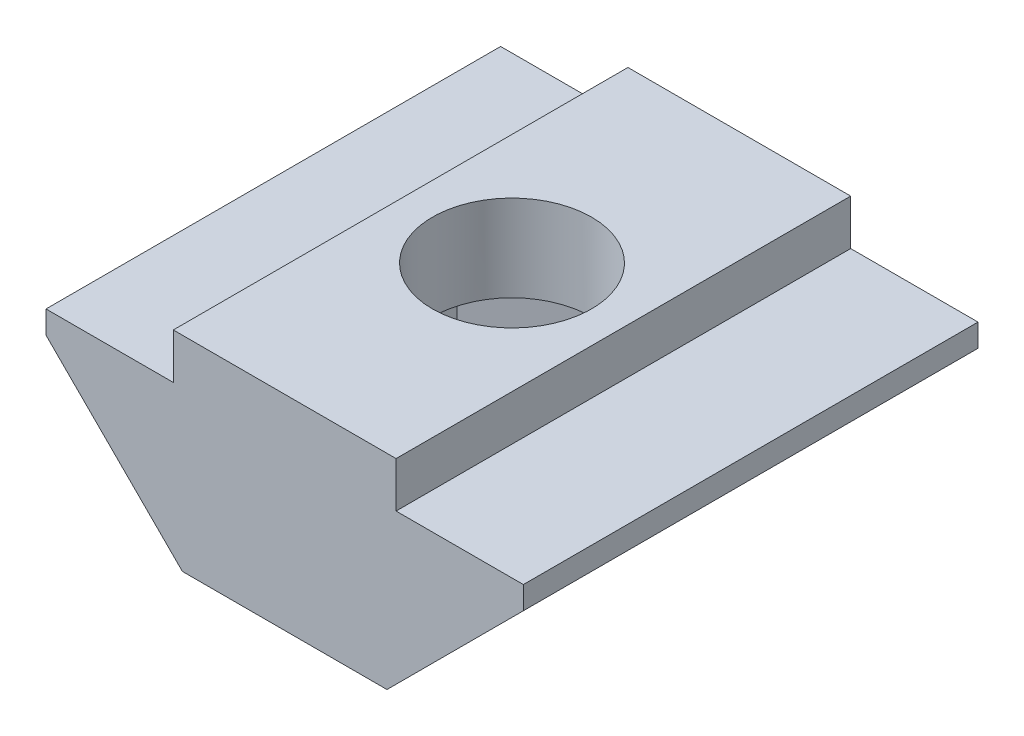
ISO-10303-21;
HEADER;
FILE_DESCRIPTION(('STEP AP214'),'2;1');
FILE_NAME('part.step','',(''),(''),'','','');
FILE_SCHEMA(('AUTOMOTIVE_DESIGN { 1 0 10303 214 1 1 1 1 }'));
ENDSEC;
DATA;
#1=APPLICATION_CONTEXT('core data for automotive mechanical design processes');
#2=APPLICATION_PROTOCOL_DEFINITION('international standard','automotive_design',2000,#1);
#3=PRODUCT_CONTEXT('',#1,'mechanical');
#4=PRODUCT('Part','Part','',(#3));
#5=PRODUCT_RELATED_PRODUCT_CATEGORY('part','',(#4));
#6=PRODUCT_DEFINITION_FORMATION('','',#4);
#7=PRODUCT_DEFINITION_CONTEXT('part definition',#1,'design');
#8=PRODUCT_DEFINITION('design','',#6,#7);
#9=PRODUCT_DEFINITION_SHAPE('','',#8);
#10=(LENGTH_UNIT() NAMED_UNIT(*) SI_UNIT(.MILLI.,.METRE.));
#11=(NAMED_UNIT(*) PLANE_ANGLE_UNIT() SI_UNIT($,.RADIAN.));
#12=(NAMED_UNIT(*) SI_UNIT($,.STERADIAN.) SOLID_ANGLE_UNIT());
#13=UNCERTAINTY_MEASURE_WITH_UNIT(LENGTH_MEASURE(1.E-05),#10,'distance_accuracy_value','');
#14=(GEOMETRIC_REPRESENTATION_CONTEXT(3) GLOBAL_UNCERTAINTY_ASSIGNED_CONTEXT((#13)) GLOBAL_UNIT_ASSIGNED_CONTEXT((#10,
#11,#12)) REPRESENTATION_CONTEXT('',''));
#15=CARTESIAN_POINT('',(0.,0.,0.));
#16=DIRECTION('',(0.,0.,1.));
#17=DIRECTION('',(1.,0.,0.));
#18=AXIS2_PLACEMENT_3D('',#15,#16,#17);
#19=CARTESIAN_POINT('',(-2.25,0.,100.));
#20=DIRECTION('',(0.,1.,0.));
#21=DIRECTION('',(-1.,0.,0.));
#22=AXIS2_PLACEMENT_3D('',#19,#20,#21);
#23=PLANE('',#22);
#24=DIRECTION('',(0.,0.,-1.));
#25=VECTOR('',#24,1.);
#26=CARTESIAN_POINT('',(2.25,0.,100.));
#27=LINE('',#26,#25);
#28=CARTESIAN_POINT('',(2.24999999999999,0.,48.0081415712958));
#29=VERTEX_POINT('',#28);
#30=CARTESIAN_POINT('',(2.25,0.,45.));
#31=VERTEX_POINT('',#30);
#32=EDGE_CURVE('E281',#29,#31,#27,.T.);
#33=ORIENTED_EDGE('',*,*,#32,.F.);
#34=DIRECTION('',(0.866025403784439,0.,0.5));
#35=VECTOR('',#34,1.);
#36=CARTESIAN_POINT('',(0.,0.,46.7091034656191));
#37=LINE('',#36,#35);
#38=CARTESIAN_POINT('',(0.,0.,46.7091034656191));
#39=VERTEX_POINT('',#38);
#40=EDGE_CURVE('E196',#39,#29,#37,.T.);
#41=ORIENTED_EDGE('',*,*,#40,.F.);
#42=DIRECTION('',(0.866025403784439,0.,-0.499999999999999));
#43=VECTOR('',#42,1.);
#44=CARTESIAN_POINT('',(-2.85,0.,48.3545517328096));
#45=LINE('',#44,#43);
#46=CARTESIAN_POINT('',(-2.25,0.,48.0081415712958));
#47=VERTEX_POINT('',#46);
#48=EDGE_CURVE('E184',#47,#39,#45,.T.);
#49=ORIENTED_EDGE('',*,*,#48,.F.);
#50=DIRECTION('',(0.,0.,-1.));
#51=VECTOR('',#50,1.);
#52=CARTESIAN_POINT('',(-2.25,0.,100.));
#53=LINE('',#52,#51);
#54=CARTESIAN_POINT('',(-2.25,0.,45.));
#55=VERTEX_POINT('',#54);
#56=EDGE_CURVE('E285',#47,#55,#53,.T.);
#57=ORIENTED_EDGE('',*,*,#56,.T.);
#58=DIRECTION('',(1.,0.,0.));
#59=VECTOR('',#58,1.);
#60=CARTESIAN_POINT('',(-5.25,0.,45.));
#61=LINE('',#60,#59);
#62=EDGE_CURVE('E248',#55,#31,#61,.T.);
#63=ORIENTED_EDGE('',*,*,#62,.T.);
#64=EDGE_LOOP('',(#33,#41,#49,#57,#63));
#65=FACE_BOUND('',#64,.T.);
#66=ADVANCED_FACE('F33',(#65),#23,.F.);
#67=CARTESIAN_POINT('',(0.,0.,50.));
#68=DIRECTION('',(0.,1.,0.));
#69=DIRECTION('',(0.,0.,1.));
#70=AXIS2_PLACEMENT_3D('',#67,#68,#69);
#71=CYLINDRICAL_SURFACE('',#70,1.75000000000001);
#72=CARTESIAN_POINT('',(0.,4.5,50.));
#73=DIRECTION('',(0.,1.,0.));
#74=DIRECTION('',(0.,0.,1.));
#75=AXIS2_PLACEMENT_3D('',#72,#73,#74);
#76=CIRCLE('',#75,1.75000000000001);
#77=CARTESIAN_POINT('',(0.,4.5,51.75));
#78=VERTEX_POINT('',#77);
#79=EDGE_CURVE('E278',#78,#78,#76,.T.);
#80=ORIENTED_EDGE('',*,*,#79,.T.);
#81=EDGE_LOOP('',(#80));
#82=FACE_BOUND('',#81,.T.);
#83=CARTESIAN_POINT('',(0.,2.6,50.));
#84=DIRECTION('',(0.,-1.,0.));
#85=DIRECTION('',(1.,0.,0.));
#86=AXIS2_PLACEMENT_3D('',#83,#84,#85);
#87=CIRCLE('',#86,1.75000000000001);
#88=CARTESIAN_POINT('',(1.75000000000001,2.6,50.));
#89=VERTEX_POINT('',#88);
#90=EDGE_CURVE('E203',#89,#89,#87,.F.);
#91=ORIENTED_EDGE('',*,*,#90,.F.);
#92=EDGE_LOOP('',(#91));
#93=FACE_BOUND('',#92,.T.);
#94=ADVANCED_FACE('F352',(#82,#93),#71,.F.);
#95=CARTESIAN_POINT('',(2.25,0.,100.));
#96=DIRECTION('',(-0.707106781186548,0.707106781186547,0.));
#97=DIRECTION('',(-0.707106781186547,-0.707106781186548,0.));
#98=AXIS2_PLACEMENT_3D('',#95,#96,#97);
#99=PLANE('',#98);
#100=DIRECTION('',(0.,0.,-1.));
#101=VECTOR('',#100,1.);
#102=CARTESIAN_POINT('',(2.85,0.600000000000003,100.));
#103=LINE('',#102,#101);
#104=CARTESIAN_POINT('',(2.85,0.600000000000003,51.6454482671904));
#105=VERTEX_POINT('',#104);
#106=CARTESIAN_POINT('',(2.85,0.600000000000003,48.3545517328096));
#107=VERTEX_POINT('',#106);
#108=EDGE_CURVE('E11',#105,#107,#103,.T.);
#109=ORIENTED_EDGE('',*,*,#108,.T.);
#110=DIRECTION('',(-0.654653670707977,-0.654653670707978,-0.377964473009227));
#111=VECTOR('',#110,1.);
#112=CARTESIAN_POINT('',(15.114648625492,12.864648625492,55.4355499182535));
#113=LINE('',#112,#111);
#114=EDGE_CURVE('E167',#107,#29,#113,.T.);
#115=ORIENTED_EDGE('',*,*,#114,.T.);
#116=ORIENTED_EDGE('',*,*,#32,.T.);
#117=DIRECTION('',(0.707106781186547,0.707106781186548,0.));
#118=VECTOR('',#117,1.);
#119=CARTESIAN_POINT('',(2.25,0.,45.));
#120=LINE('',#119,#118);
#121=CARTESIAN_POINT('',(5.25,3.,45.));
#122=VERTEX_POINT('',#121);
#123=EDGE_CURVE('E275',#31,#122,#120,.T.);
#124=ORIENTED_EDGE('',*,*,#123,.T.);
#125=DIRECTION('',(0.,0.,-1.));
#126=VECTOR('',#125,1.);
#127=CARTESIAN_POINT('',(5.25,3.,100.));
#128=LINE('',#127,#126);
#129=CARTESIAN_POINT('',(5.25,3.,55.));
#130=VERTEX_POINT('',#129);
#131=EDGE_CURVE('E303',#130,#122,#128,.T.);
#132=ORIENTED_EDGE('',*,*,#131,.F.);
#133=DIRECTION('',(-0.707106781186547,-0.707106781186548,0.));
#134=VECTOR('',#133,1.);
#135=CARTESIAN_POINT('',(2.25,0.,55.));
#136=LINE('',#135,#134);
#137=CARTESIAN_POINT('',(2.25,0.,55.));
#138=VERTEX_POINT('',#137);
#139=EDGE_CURVE('E245',#130,#138,#136,.T.);
#140=ORIENTED_EDGE('',*,*,#139,.T.);
#141=CARTESIAN_POINT('',(2.25,0.,51.9918584287042));
#142=VERTEX_POINT('',#141);
#143=EDGE_CURVE('E282',#138,#142,#27,.T.);
#144=ORIENTED_EDGE('',*,*,#143,.T.);
#145=DIRECTION('',(0.654653670707977,0.654653670707977,-0.377964473009228));
#146=VECTOR('',#145,1.);
#147=CARTESIAN_POINT('',(-9.62893433977771,-11.8789343397777,58.8501643674608));
#148=LINE('',#147,#146);
#149=EDGE_CURVE('E48',#142,#105,#148,.T.);
#150=ORIENTED_EDGE('',*,*,#149,.T.);
#151=EDGE_LOOP('',(#109,#115,#116,#124,#132,#140,#144,#150));
#152=FACE_BOUND('',#151,.T.);
#153=ADVANCED_FACE('F35',(#152),#99,.F.);
#154=CARTESIAN_POINT('',(5.25,3.,100.));
#155=DIRECTION('',(-1.,0.,0.));
#156=DIRECTION('',(0.,-1.,0.));
#157=AXIS2_PLACEMENT_3D('',#154,#155,#156);
#158=PLANE('',#157);
#159=DIRECTION('',(0.,0.,-1.));
#160=VECTOR('',#159,1.);
#161=CARTESIAN_POINT('',(5.25,3.5,100.));
#162=LINE('',#161,#160);
#163=CARTESIAN_POINT('',(5.25,3.5,55.));
#164=VERTEX_POINT('',#163);
#165=CARTESIAN_POINT('',(5.25,3.5,45.));
#166=VERTEX_POINT('',#165);
#167=EDGE_CURVE('E301',#164,#166,#162,.T.);
#168=ORIENTED_EDGE('',*,*,#167,.F.);
#169=DIRECTION('',(0.,1.,0.));
#170=VECTOR('',#169,1.);
#171=CARTESIAN_POINT('',(5.25,0.,55.));
#172=LINE('',#171,#170);
#173=EDGE_CURVE('E224',#130,#164,#172,.T.);
#174=ORIENTED_EDGE('',*,*,#173,.F.);
#175=ORIENTED_EDGE('',*,*,#131,.T.);
#176=DIRECTION('',(0.,1.,0.));
#177=VECTOR('',#176,1.);
#178=CARTESIAN_POINT('',(5.25,0.,45.));
#179=LINE('',#178,#177);
#180=EDGE_CURVE('E252',#122,#166,#179,.T.);
#181=ORIENTED_EDGE('',*,*,#180,.T.);
#182=EDGE_LOOP('',(#168,#174,#175,#181));
#183=FACE_BOUND('',#182,.T.);
#184=ADVANCED_FACE('F332',(#183),#158,.F.);
#185=CARTESIAN_POINT('',(5.25,3.5,100.));
#186=DIRECTION('',(0.,-1.,0.));
#187=DIRECTION('',(1.,0.,0.));
#188=AXIS2_PLACEMENT_3D('',#185,#186,#187);
#189=PLANE('',#188);
#190=DIRECTION('',(0.,0.,-1.));
#191=VECTOR('',#190,1.);
#192=CARTESIAN_POINT('',(2.45,3.5,100.));
#193=LINE('',#192,#191);
#194=CARTESIAN_POINT('',(2.45,3.5,55.));
#195=VERTEX_POINT('',#194);
#196=CARTESIAN_POINT('',(2.45,3.5,45.));
#197=VERTEX_POINT('',#196);
#198=EDGE_CURVE('E299',#195,#197,#193,.T.);
#199=ORIENTED_EDGE('',*,*,#198,.F.);
#200=DIRECTION('',(1.,0.,0.));
#201=VECTOR('',#200,1.);
#202=CARTESIAN_POINT('',(5.25,3.5,55.));
#203=LINE('',#202,#201);
#204=EDGE_CURVE('E242',#195,#164,#203,.T.);
#205=ORIENTED_EDGE('',*,*,#204,.T.);
#206=ORIENTED_EDGE('',*,*,#167,.T.);
#207=DIRECTION('',(-1.,0.,0.));
#208=VECTOR('',#207,1.);
#209=CARTESIAN_POINT('',(5.25,3.5,45.));
#210=LINE('',#209,#208);
#211=EDGE_CURVE('E272',#166,#197,#210,.T.);
#212=ORIENTED_EDGE('',*,*,#211,.T.);
#213=EDGE_LOOP('',(#199,#205,#206,#212));
#214=FACE_BOUND('',#213,.T.);
#215=ADVANCED_FACE('F389',(#214),#189,.F.);
#216=CARTESIAN_POINT('',(2.45,3.5,100.));
#217=DIRECTION('',(-1.,0.,0.));
#218=DIRECTION('',(0.,0.,1.));
#219=AXIS2_PLACEMENT_3D('',#216,#217,#218);
#220=PLANE('',#219);
#221=DIRECTION('',(0.,0.,-1.));
#222=VECTOR('',#221,1.);
#223=CARTESIAN_POINT('',(2.45,4.5,100.));
#224=LINE('',#223,#222);
#225=CARTESIAN_POINT('',(2.45,4.5,55.));
#226=VERTEX_POINT('',#225);
#227=CARTESIAN_POINT('',(2.45,4.5,45.));
#228=VERTEX_POINT('',#227);
#229=EDGE_CURVE('E297',#226,#228,#224,.T.);
#230=ORIENTED_EDGE('',*,*,#229,.F.);
#231=DIRECTION('',(0.,-1.,0.));
#232=VECTOR('',#231,1.);
#233=CARTESIAN_POINT('',(2.45,3.5,55.));
#234=LINE('',#233,#232);
#235=EDGE_CURVE('E239',#226,#195,#234,.T.);
#236=ORIENTED_EDGE('',*,*,#235,.T.);
#237=ORIENTED_EDGE('',*,*,#198,.T.);
#238=DIRECTION('',(0.,1.,0.));
#239=VECTOR('',#238,1.);
#240=CARTESIAN_POINT('',(2.45,3.5,45.));
#241=LINE('',#240,#239);
#242=EDGE_CURVE('E269',#197,#228,#241,.T.);
#243=ORIENTED_EDGE('',*,*,#242,.T.);
#244=EDGE_LOOP('',(#230,#236,#237,#243));
#245=FACE_BOUND('',#244,.T.);
#246=ADVANCED_FACE('F385',(#245),#220,.F.);
#247=CARTESIAN_POINT('',(2.45,4.5,100.));
#248=DIRECTION('',(0.,-1.,0.));
#249=DIRECTION('',(1.,0.,0.));
#250=AXIS2_PLACEMENT_3D('',#247,#248,#249);
#251=PLANE('',#250);
#252=ORIENTED_EDGE('',*,*,#79,.F.);
#253=EDGE_LOOP('',(#252));
#254=FACE_BOUND('',#253,.T.);
#255=DIRECTION('',(0.,0.,-1.));
#256=VECTOR('',#255,1.);
#257=CARTESIAN_POINT('',(-2.45,4.5,100.));
#258=LINE('',#257,#256);
#259=CARTESIAN_POINT('',(-2.45,4.5,55.));
#260=VERTEX_POINT('',#259);
#261=CARTESIAN_POINT('',(-2.45,4.5,45.));
#262=VERTEX_POINT('',#261);
#263=EDGE_CURVE('E295',#260,#262,#258,.T.);
#264=ORIENTED_EDGE('',*,*,#263,.F.);
#265=DIRECTION('',(1.,0.,0.));
#266=VECTOR('',#265,1.);
#267=CARTESIAN_POINT('',(2.45,4.5,55.));
#268=LINE('',#267,#266);
#269=EDGE_CURVE('E236',#260,#226,#268,.T.);
#270=ORIENTED_EDGE('',*,*,#269,.T.);
#271=ORIENTED_EDGE('',*,*,#229,.T.);
#272=DIRECTION('',(-1.,0.,0.));
#273=VECTOR('',#272,1.);
#274=CARTESIAN_POINT('',(2.45,4.5,45.));
#275=LINE('',#274,#273);
#276=EDGE_CURVE('E266',#228,#262,#275,.T.);
#277=ORIENTED_EDGE('',*,*,#276,.T.);
#278=EDGE_LOOP('',(#264,#270,#271,#277));
#279=FACE_BOUND('',#278,.T.);
#280=ADVANCED_FACE('F381',(#254,#279),#251,.F.);
#281=CARTESIAN_POINT('',(-2.45,3.5,100.));
#282=DIRECTION('',(1.,0.,0.));
#283=DIRECTION('',(0.,0.,-1.));
#284=AXIS2_PLACEMENT_3D('',#281,#282,#283);
#285=PLANE('',#284);
#286=DIRECTION('',(0.,0.,-1.));
#287=VECTOR('',#286,1.);
#288=CARTESIAN_POINT('',(-2.45,3.5,100.));
#289=LINE('',#288,#287);
#290=CARTESIAN_POINT('',(-2.45,3.5,55.));
#291=VERTEX_POINT('',#290);
#292=CARTESIAN_POINT('',(-2.45,3.5,45.));
#293=VERTEX_POINT('',#292);
#294=EDGE_CURVE('E293',#291,#293,#289,.T.);
#295=ORIENTED_EDGE('',*,*,#294,.F.);
#296=DIRECTION('',(0.,1.,0.));
#297=VECTOR('',#296,1.);
#298=CARTESIAN_POINT('',(-2.45,3.5,55.));
#299=LINE('',#298,#297);
#300=EDGE_CURVE('E233',#291,#260,#299,.T.);
#301=ORIENTED_EDGE('',*,*,#300,.T.);
#302=ORIENTED_EDGE('',*,*,#263,.T.);
#303=DIRECTION('',(0.,-1.,0.));
#304=VECTOR('',#303,1.);
#305=CARTESIAN_POINT('',(-2.45,3.5,45.));
#306=LINE('',#305,#304);
#307=EDGE_CURVE('E263',#262,#293,#306,.T.);
#308=ORIENTED_EDGE('',*,*,#307,.T.);
#309=EDGE_LOOP('',(#295,#301,#302,#308));
#310=FACE_BOUND('',#309,.T.);
#311=ADVANCED_FACE('F377',(#310),#285,.F.);
#312=CARTESIAN_POINT('',(-5.25,3.5,100.));
#313=DIRECTION('',(0.,-1.,0.));
#314=DIRECTION('',(0.,0.,-1.));
#315=AXIS2_PLACEMENT_3D('',#312,#313,#314);
#316=PLANE('',#315);
#317=DIRECTION('',(0.,0.,-1.));
#318=VECTOR('',#317,1.);
#319=CARTESIAN_POINT('',(-5.25,3.5,100.));
#320=LINE('',#319,#318);
#321=CARTESIAN_POINT('',(-5.25,3.5,55.));
#322=VERTEX_POINT('',#321);
#323=CARTESIAN_POINT('',(-5.25,3.5,45.));
#324=VERTEX_POINT('',#323);
#325=EDGE_CURVE('E291',#322,#324,#320,.T.);
#326=ORIENTED_EDGE('',*,*,#325,.F.);
#327=DIRECTION('',(1.,0.,0.));
#328=VECTOR('',#327,1.);
#329=CARTESIAN_POINT('',(-5.25,3.5,55.));
#330=LINE('',#329,#328);
#331=EDGE_CURVE('E230',#322,#291,#330,.T.);
#332=ORIENTED_EDGE('',*,*,#331,.T.);
#333=ORIENTED_EDGE('',*,*,#294,.T.);
#334=DIRECTION('',(-1.,0.,0.));
#335=VECTOR('',#334,1.);
#336=CARTESIAN_POINT('',(-5.25,3.5,45.));
#337=LINE('',#336,#335);
#338=EDGE_CURVE('E260',#293,#324,#337,.T.);
#339=ORIENTED_EDGE('',*,*,#338,.T.);
#340=EDGE_LOOP('',(#326,#332,#333,#339));
#341=FACE_BOUND('',#340,.T.);
#342=ADVANCED_FACE('F371',(#341),#316,.F.);
#343=CARTESIAN_POINT('',(-5.25,3.,100.));
#344=DIRECTION('',(1.,0.,0.));
#345=DIRECTION('',(0.,1.,0.));
#346=AXIS2_PLACEMENT_3D('',#343,#344,#345);
#347=PLANE('',#346);
#348=DIRECTION('',(0.,0.,-1.));
#349=VECTOR('',#348,1.);
#350=CARTESIAN_POINT('',(-5.25,3.,100.));
#351=LINE('',#350,#349);
#352=CARTESIAN_POINT('',(-5.25,3.,55.));
#353=VERTEX_POINT('',#352);
#354=CARTESIAN_POINT('',(-5.25,3.,45.));
#355=VERTEX_POINT('',#354);
#356=EDGE_CURVE('E289',#353,#355,#351,.T.);
#357=ORIENTED_EDGE('',*,*,#356,.F.);
#358=DIRECTION('',(0.,1.,0.));
#359=VECTOR('',#358,1.);
#360=CARTESIAN_POINT('',(-5.25,0.,55.));
#361=LINE('',#360,#359);
#362=EDGE_CURVE('E225',#353,#322,#361,.T.);
#363=ORIENTED_EDGE('',*,*,#362,.T.);
#364=ORIENTED_EDGE('',*,*,#325,.T.);
#365=DIRECTION('',(0.,1.,0.));
#366=VECTOR('',#365,1.);
#367=CARTESIAN_POINT('',(-5.25,0.,45.));
#368=LINE('',#367,#366);
#369=EDGE_CURVE('E251',#355,#324,#368,.T.);
#370=ORIENTED_EDGE('',*,*,#369,.F.);
#371=EDGE_LOOP('',(#357,#363,#364,#370));
#372=FACE_BOUND('',#371,.T.);
#373=ADVANCED_FACE('F367',(#372),#347,.F.);
#374=CARTESIAN_POINT('',(-2.25,0.,100.));
#375=DIRECTION('',(0.707106781186548,0.707106781186547,0.));
#376=DIRECTION('',(-0.707106781186547,0.707106781186548,0.));
#377=AXIS2_PLACEMENT_3D('',#374,#375,#376);
#378=PLANE('',#377);
#379=ORIENTED_EDGE('',*,*,#56,.F.);
#380=DIRECTION('',(-0.654653670707977,0.654653670707978,0.377964473009226));
#381=VECTOR('',#380,1.);
#382=CARTESIAN_POINT('',(-15.1146486254919,12.864648625492,55.4355499182535));
#383=LINE('',#382,#381);
#384=CARTESIAN_POINT('',(-2.85,0.599999999999997,48.3545517328096));
#385=VERTEX_POINT('',#384);
#386=EDGE_CURVE('E218',#47,#385,#383,.T.);
#387=ORIENTED_EDGE('',*,*,#386,.T.);
#388=DIRECTION('',(0.,0.,1.));
#389=VECTOR('',#388,1.);
#390=CARTESIAN_POINT('',(-2.85,0.599999999999997,100.));
#391=LINE('',#390,#389);
#392=CARTESIAN_POINT('',(-2.85,0.600000000000007,51.6454482671904));
#393=VERTEX_POINT('',#392);
#394=EDGE_CURVE('E41',#385,#393,#391,.T.);
#395=ORIENTED_EDGE('',*,*,#394,.T.);
#396=DIRECTION('',(0.654653670707977,-0.654653670707977,0.377964473009228));
#397=VECTOR('',#396,1.);
#398=CARTESIAN_POINT('',(9.62893433977771,-11.8789343397777,58.8501643674608));
#399=LINE('',#398,#397);
#400=CARTESIAN_POINT('',(-2.25,0.,51.9918584287042));
#401=VERTEX_POINT('',#400);
#402=EDGE_CURVE('E215',#393,#401,#399,.T.);
#403=ORIENTED_EDGE('',*,*,#402,.T.);
#404=CARTESIAN_POINT('',(-2.25,0.,55.));
#405=VERTEX_POINT('',#404);
#406=EDGE_CURVE('E286',#405,#401,#53,.T.);
#407=ORIENTED_EDGE('',*,*,#406,.F.);
#408=DIRECTION('',(-0.707106781186547,0.707106781186548,0.));
#409=VECTOR('',#408,1.);
#410=CARTESIAN_POINT('',(-2.25,0.,55.));
#411=LINE('',#410,#409);
#412=EDGE_CURVE('E56',#405,#353,#411,.T.);
#413=ORIENTED_EDGE('',*,*,#412,.T.);
#414=ORIENTED_EDGE('',*,*,#356,.T.);
#415=DIRECTION('',(0.707106781186547,-0.707106781186548,0.));
#416=VECTOR('',#415,1.);
#417=CARTESIAN_POINT('',(-2.25,0.,45.));
#418=LINE('',#417,#416);
#419=EDGE_CURVE('E255',#355,#55,#418,.T.);
#420=ORIENTED_EDGE('',*,*,#419,.T.);
#421=EDGE_LOOP('',(#379,#387,#395,#403,#407,#413,#414,#420));
#422=FACE_BOUND('',#421,.T.);
#423=ADVANCED_FACE('F309',(#422),#378,.F.);
#424=ORIENTED_EDGE('',*,*,#406,.T.);
#425=DIRECTION('',(-0.866025403784438,0.,-0.500000000000001));
#426=VECTOR('',#425,1.);
#427=CARTESIAN_POINT('',(0.,0.,53.2908965343809));
#428=LINE('',#427,#426);
#429=CARTESIAN_POINT('',(0.,0.,53.2908965343809));
#430=VERTEX_POINT('',#429);
#431=EDGE_CURVE('E186',#430,#401,#428,.T.);
#432=ORIENTED_EDGE('',*,*,#431,.F.);
#433=DIRECTION('',(-0.866025403784438,0.,0.500000000000001));
#434=VECTOR('',#433,1.);
#435=CARTESIAN_POINT('',(2.85,0.,51.6454482671904));
#436=LINE('',#435,#434);
#437=EDGE_CURVE('E198',#142,#430,#436,.T.);
#438=ORIENTED_EDGE('',*,*,#437,.F.);
#439=ORIENTED_EDGE('',*,*,#143,.F.);
#440=DIRECTION('',(-1.,0.,0.));
#441=VECTOR('',#440,1.);
#442=CARTESIAN_POINT('',(-5.25,0.,55.));
#443=LINE('',#442,#441);
#444=EDGE_CURVE('E222',#138,#405,#443,.T.);
#445=ORIENTED_EDGE('',*,*,#444,.T.);
#446=EDGE_LOOP('',(#424,#432,#438,#439,#445));
#447=FACE_BOUND('',#446,.T.);
#448=ADVANCED_FACE('F336',(#447),#23,.F.);
#449=CARTESIAN_POINT('',(-5.25,0.,45.));
#450=DIRECTION('',(0.,0.,1.));
#451=DIRECTION('',(1.,0.,0.));
#452=AXIS2_PLACEMENT_3D('',#449,#450,#451);
#453=PLANE('',#452);
#454=ORIENTED_EDGE('',*,*,#62,.F.);
#455=ORIENTED_EDGE('',*,*,#419,.F.);
#456=ORIENTED_EDGE('',*,*,#369,.T.);
#457=ORIENTED_EDGE('',*,*,#338,.F.);
#458=ORIENTED_EDGE('',*,*,#307,.F.);
#459=ORIENTED_EDGE('',*,*,#276,.F.);
#460=ORIENTED_EDGE('',*,*,#242,.F.);
#461=ORIENTED_EDGE('',*,*,#211,.F.);
#462=ORIENTED_EDGE('',*,*,#180,.F.);
#463=ORIENTED_EDGE('',*,*,#123,.F.);
#464=EDGE_LOOP('',(#454,#455,#456,#457,#458,#459,#460,#461,#462,#463));
#465=FACE_BOUND('',#464,.T.);
#466=ADVANCED_FACE('F326',(#465),#453,.F.);
#467=CARTESIAN_POINT('',(-5.25,0.,55.));
#468=DIRECTION('',(0.,0.,-1.));
#469=DIRECTION('',(-1.,0.,0.));
#470=AXIS2_PLACEMENT_3D('',#467,#468,#469);
#471=PLANE('',#470);
#472=ORIENTED_EDGE('',*,*,#173,.T.);
#473=ORIENTED_EDGE('',*,*,#204,.F.);
#474=ORIENTED_EDGE('',*,*,#235,.F.);
#475=ORIENTED_EDGE('',*,*,#269,.F.);
#476=ORIENTED_EDGE('',*,*,#300,.F.);
#477=ORIENTED_EDGE('',*,*,#331,.F.);
#478=ORIENTED_EDGE('',*,*,#362,.F.);
#479=ORIENTED_EDGE('',*,*,#412,.F.);
#480=ORIENTED_EDGE('',*,*,#444,.F.);
#481=ORIENTED_EDGE('',*,*,#139,.F.);
#482=EDGE_LOOP('',(#472,#473,#474,#475,#476,#477,#478,#479,#480,#481));
#483=FACE_BOUND('',#482,.T.);
#484=ADVANCED_FACE('F365',(#483),#471,.F.);
#485=CARTESIAN_POINT('',(2.85,2.6,48.3545517328096));
#486=DIRECTION('',(1.,0.,0.));
#487=DIRECTION('',(0.,1.,0.));
#488=AXIS2_PLACEMENT_3D('',#485,#486,#487);
#489=PLANE('',#488);
#490=DIRECTION('',(0.,-1.,0.));
#491=VECTOR('',#490,1.);
#492=CARTESIAN_POINT('',(2.85,2.6,51.6454482671904));
#493=LINE('',#492,#491);
#494=CARTESIAN_POINT('',(2.85,2.6,51.6454482671904));
#495=VERTEX_POINT('',#494);
#496=EDGE_CURVE('E169',#495,#105,#493,.T.);
#497=ORIENTED_EDGE('',*,*,#496,.F.);
#498=DIRECTION('',(0.,0.,1.));
#499=VECTOR('',#498,1.);
#500=CARTESIAN_POINT('',(2.85,2.6,48.3545517328096));
#501=LINE('',#500,#499);
#502=CARTESIAN_POINT('',(2.85,2.6,48.3545517328096));
#503=VERTEX_POINT('',#502);
#504=EDGE_CURVE('E173',#503,#495,#501,.T.);
#505=ORIENTED_EDGE('',*,*,#504,.F.);
#506=DIRECTION('',(0.,-1.,0.));
#507=VECTOR('',#506,1.);
#508=CARTESIAN_POINT('',(2.85,2.6,48.3545517328096));
#509=LINE('',#508,#507);
#510=EDGE_CURVE('E159',#503,#107,#509,.T.);
#511=ORIENTED_EDGE('',*,*,#510,.T.);
#512=ORIENTED_EDGE('',*,*,#108,.F.);
#513=EDGE_LOOP('',(#497,#505,#511,#512));
#514=FACE_BOUND('',#513,.T.);
#515=ADVANCED_FACE('F174',(#514),#489,.F.);
#516=CARTESIAN_POINT('',(-2.85,2.6,51.6454482671904));
#517=DIRECTION('',(-1.,0.,0.));
#518=DIRECTION('',(0.,-1.,0.));
#519=AXIS2_PLACEMENT_3D('',#516,#517,#518);
#520=PLANE('',#519);
#521=DIRECTION('',(0.,-1.,0.));
#522=VECTOR('',#521,1.);
#523=CARTESIAN_POINT('',(-2.85,2.6,48.3545517328096));
#524=LINE('',#523,#522);
#525=CARTESIAN_POINT('',(-2.85,2.6,48.3545517328096));
#526=VERTEX_POINT('',#525);
#527=EDGE_CURVE('E204',#526,#385,#524,.T.);
#528=ORIENTED_EDGE('',*,*,#527,.F.);
#529=DIRECTION('',(0.,0.,-1.));
#530=VECTOR('',#529,1.);
#531=CARTESIAN_POINT('',(-2.85,2.6,51.6454482671904));
#532=LINE('',#531,#530);
#533=CARTESIAN_POINT('',(-2.85,2.6,51.6454482671904));
#534=VERTEX_POINT('',#533);
#535=EDGE_CURVE('E193',#534,#526,#532,.T.);
#536=ORIENTED_EDGE('',*,*,#535,.F.);
#537=DIRECTION('',(0.,-1.,0.));
#538=VECTOR('',#537,1.);
#539=CARTESIAN_POINT('',(-2.85,2.6,51.6454482671904));
#540=LINE('',#539,#538);
#541=EDGE_CURVE('E207',#534,#393,#540,.T.);
#542=ORIENTED_EDGE('',*,*,#541,.T.);
#543=ORIENTED_EDGE('',*,*,#394,.F.);
#544=EDGE_LOOP('',(#528,#536,#542,#543));
#545=FACE_BOUND('',#544,.T.);
#546=ADVANCED_FACE('F312',(#545),#520,.F.);
#547=CARTESIAN_POINT('',(0.,2.6,46.7091034656191));
#548=DIRECTION('',(0.5,0.,-0.866025403784439));
#549=DIRECTION('',(-0.866025403784439,0.,-0.5));
#550=AXIS2_PLACEMENT_3D('',#547,#548,#549);
#551=PLANE('',#550);
#552=ORIENTED_EDGE('',*,*,#510,.F.);
#553=DIRECTION('',(0.866025403784439,0.,0.5));
#554=VECTOR('',#553,1.);
#555=CARTESIAN_POINT('',(0.,2.6,46.7091034656191));
#556=LINE('',#555,#554);
#557=CARTESIAN_POINT('',(0.,2.6,46.7091034656191));
#558=VERTEX_POINT('',#557);
#559=EDGE_CURVE('E164',#558,#503,#556,.T.);
#560=ORIENTED_EDGE('',*,*,#559,.F.);
#561=DIRECTION('',(0.,-1.,0.));
#562=VECTOR('',#561,1.);
#563=CARTESIAN_POINT('',(0.,2.6,46.7091034656191));
#564=LINE('',#563,#562);
#565=EDGE_CURVE('E201',#558,#39,#564,.T.);
#566=ORIENTED_EDGE('',*,*,#565,.T.);
#567=ORIENTED_EDGE('',*,*,#40,.T.);
#568=ORIENTED_EDGE('',*,*,#114,.F.);
#569=EDGE_LOOP('',(#552,#560,#566,#567,#568));
#570=FACE_BOUND('',#569,.T.);
#571=ADVANCED_FACE('F161',(#570),#551,.F.);
#572=CARTESIAN_POINT('',(-2.85,2.6,48.3545517328096));
#573=DIRECTION('',(-0.499999999999999,0.,-0.866025403784439));
#574=DIRECTION('',(-0.866025403784439,0.,0.499999999999999));
#575=AXIS2_PLACEMENT_3D('',#572,#573,#574);
#576=PLANE('',#575);
#577=ORIENTED_EDGE('',*,*,#48,.T.);
#578=ORIENTED_EDGE('',*,*,#565,.F.);
#579=DIRECTION('',(0.866025403784439,0.,-0.499999999999999));
#580=VECTOR('',#579,1.);
#581=CARTESIAN_POINT('',(-2.85,2.6,48.3545517328096));
#582=LINE('',#581,#580);
#583=EDGE_CURVE('E170',#526,#558,#582,.T.);
#584=ORIENTED_EDGE('',*,*,#583,.F.);
#585=ORIENTED_EDGE('',*,*,#527,.T.);
#586=ORIENTED_EDGE('',*,*,#386,.F.);
#587=EDGE_LOOP('',(#577,#578,#584,#585,#586));
#588=FACE_BOUND('',#587,.T.);
#589=ADVANCED_FACE('F315',(#588),#576,.F.);
#590=CARTESIAN_POINT('',(0.,2.6,53.2908965343809));
#591=DIRECTION('',(-0.500000000000001,0.,0.866025403784438));
#592=DIRECTION('',(0.866025403784438,0.,0.500000000000001));
#593=AXIS2_PLACEMENT_3D('',#590,#591,#592);
#594=PLANE('',#593);
#595=ORIENTED_EDGE('',*,*,#541,.F.);
#596=DIRECTION('',(-0.866025403784438,0.,-0.500000000000001));
#597=VECTOR('',#596,1.);
#598=CARTESIAN_POINT('',(0.,2.6,53.2908965343809));
#599=LINE('',#598,#597);
#600=CARTESIAN_POINT('',(0.,2.6,53.2908965343809));
#601=VERTEX_POINT('',#600);
#602=EDGE_CURVE('E190',#601,#534,#599,.T.);
#603=ORIENTED_EDGE('',*,*,#602,.F.);
#604=DIRECTION('',(0.,-1.,0.));
#605=VECTOR('',#604,1.);
#606=CARTESIAN_POINT('',(0.,2.6,53.2908965343809));
#607=LINE('',#606,#605);
#608=EDGE_CURVE('E210',#601,#430,#607,.T.);
#609=ORIENTED_EDGE('',*,*,#608,.T.);
#610=ORIENTED_EDGE('',*,*,#431,.T.);
#611=ORIENTED_EDGE('',*,*,#402,.F.);
#612=EDGE_LOOP('',(#595,#603,#609,#610,#611));
#613=FACE_BOUND('',#612,.T.);
#614=ADVANCED_FACE('F341',(#613),#594,.F.);
#615=CARTESIAN_POINT('',(2.85,2.6,51.6454482671904));
#616=DIRECTION('',(0.500000000000001,0.,0.866025403784438));
#617=DIRECTION('',(0.866025403784438,0.,-0.500000000000001));
#618=AXIS2_PLACEMENT_3D('',#615,#616,#617);
#619=PLANE('',#618);
#620=ORIENTED_EDGE('',*,*,#437,.T.);
#621=ORIENTED_EDGE('',*,*,#608,.F.);
#622=DIRECTION('',(-0.866025403784438,0.,0.500000000000001));
#623=VECTOR('',#622,1.);
#624=CARTESIAN_POINT('',(2.85,2.6,51.6454482671904));
#625=LINE('',#624,#623);
#626=EDGE_CURVE('E178',#495,#601,#625,.T.);
#627=ORIENTED_EDGE('',*,*,#626,.F.);
#628=ORIENTED_EDGE('',*,*,#496,.T.);
#629=ORIENTED_EDGE('',*,*,#149,.F.);
#630=EDGE_LOOP('',(#620,#621,#627,#628,#629));
#631=FACE_BOUND('',#630,.T.);
#632=ADVANCED_FACE('F338',(#631),#619,.F.);
#633=CARTESIAN_POINT('',(0.,2.6,0.));
#634=DIRECTION('',(0.,-1.,0.));
#635=DIRECTION('',(1.,0.,0.));
#636=AXIS2_PLACEMENT_3D('',#633,#634,#635);
#637=PLANE('',#636);
#638=ORIENTED_EDGE('',*,*,#559,.T.);
#639=ORIENTED_EDGE('',*,*,#504,.T.);
#640=ORIENTED_EDGE('',*,*,#626,.T.);
#641=ORIENTED_EDGE('',*,*,#602,.T.);
#642=ORIENTED_EDGE('',*,*,#535,.T.);
#643=ORIENTED_EDGE('',*,*,#583,.T.);
#644=EDGE_LOOP('',(#638,#639,#640,#641,#642,#643));
#645=FACE_BOUND('',#644,.T.);
#646=ORIENTED_EDGE('',*,*,#90,.T.);
#647=EDGE_LOOP('',(#646));
#648=FACE_BOUND('',#647,.T.);
#649=ADVANCED_FACE('F180',(#645,#648),#637,.T.);
#650=CLOSED_SHELL('',(#66,#94,#153,#184,#215,#246,#280,#311,#342,#373,#423,#448,#466,#484,#515,
#546,#571,#589,#614,#632,#649));
#651=MANIFOLD_SOLID_BREP('B2',#650);
#652=ADVANCED_BREP_SHAPE_REPRESENTATION('',(#18,#651),#14);
#653=SHAPE_DEFINITION_REPRESENTATION(#9,#652);
ENDSEC;
END-ISO-10303-21;
